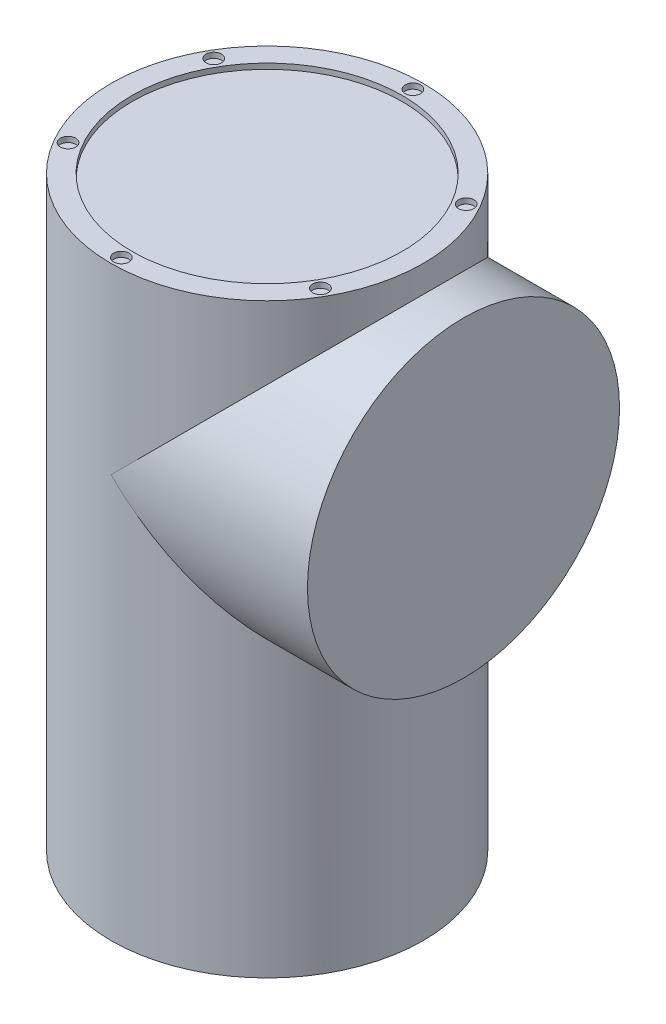
ISO-10303-21;
HEADER;
FILE_DESCRIPTION(('STEP AP214'),'2;1');
FILE_NAME('part.step','',(''),(''),'','','');
FILE_SCHEMA(('AUTOMOTIVE_DESIGN { 1 0 10303 214 1 1 1 1 }'));
ENDSEC;
DATA;
#1=APPLICATION_CONTEXT('core data for automotive mechanical design processes');
#2=APPLICATION_PROTOCOL_DEFINITION('international standard','automotive_design',2000,#1);
#3=PRODUCT_CONTEXT('',#1,'mechanical');
#4=PRODUCT('Part','Part','',(#3));
#5=PRODUCT_RELATED_PRODUCT_CATEGORY('part','',(#4));
#6=PRODUCT_DEFINITION_FORMATION('','',#4);
#7=PRODUCT_DEFINITION_CONTEXT('part definition',#1,'design');
#8=PRODUCT_DEFINITION('design','',#6,#7);
#9=PRODUCT_DEFINITION_SHAPE('','',#8);
#10=(LENGTH_UNIT() NAMED_UNIT(*) SI_UNIT(.MILLI.,.METRE.));
#11=(NAMED_UNIT(*) PLANE_ANGLE_UNIT() SI_UNIT($,.RADIAN.));
#12=(NAMED_UNIT(*) SI_UNIT($,.STERADIAN.) SOLID_ANGLE_UNIT());
#13=UNCERTAINTY_MEASURE_WITH_UNIT(LENGTH_MEASURE(1.E-05),#10,'distance_accuracy_value','');
#14=(GEOMETRIC_REPRESENTATION_CONTEXT(3) GLOBAL_UNCERTAINTY_ASSIGNED_CONTEXT((#13)) GLOBAL_UNIT_ASSIGNED_CONTEXT((#10,
#11,#12)) REPRESENTATION_CONTEXT('',''));
#15=CARTESIAN_POINT('',(0.,0.,0.));
#16=DIRECTION('',(0.,0.,1.));
#17=DIRECTION('',(1.,0.,0.));
#18=AXIS2_PLACEMENT_3D('',#15,#16,#17);
#19=CARTESIAN_POINT('',(0.,296.,0.));
#20=DIRECTION('',(0.,1.,0.));
#21=DIRECTION('',(-1.,0.,0.));
#22=AXIS2_PLACEMENT_3D('',#19,#20,#21);
#23=CYLINDRICAL_SURFACE('',#22,58.);
#24=CARTESIAN_POINT('',(0.,80.,0.));
#25=DIRECTION('',(0.,1.,0.));
#26=DIRECTION('',(-1.,0.,0.));
#27=AXIS2_PLACEMENT_3D('',#24,#25,#26);
#28=CIRCLE('',#27,58.);
#29=CARTESIAN_POINT('',(-58.,80.,0.));
#30=VERTEX_POINT('',#29);
#31=EDGE_CURVE('E124',#30,#30,#28,.T.);
#32=ORIENTED_EDGE('',*,*,#31,.T.);
#33=EDGE_LOOP('',(#32));
#34=FACE_BOUND('',#33,.T.);
#35=CARTESIAN_POINT('',(0.,298.,0.));
#36=DIRECTION('',(0.,1.,0.));
#37=DIRECTION('',(-1.,0.,0.));
#38=AXIS2_PLACEMENT_3D('',#35,#36,#37);
#39=CIRCLE('',#38,58.);
#40=CARTESIAN_POINT('',(-58.,298.,0.));
#41=VERTEX_POINT('',#40);
#42=EDGE_CURVE('E127',#41,#41,#39,.T.);
#43=ORIENTED_EDGE('',*,*,#42,.F.);
#44=EDGE_LOOP('',(#43));
#45=FACE_BOUND('',#44,.T.);
#46=CARTESIAN_POINT('',(0.,230.,0.));
#47=DIRECTION('',(0.707106781186547,0.707106781186548,0.));
#48=DIRECTION('',(-0.707106781186547,0.707106781186547,0.));
#49=AXIS2_PLACEMENT_3D('',#46,#47,#48);
#50=ELLIPSE('',#49,82.0243866176395,58.);
#51=CARTESIAN_POINT('',(0.,230.,-58.));
#52=VERTEX_POINT('',#51);
#53=CARTESIAN_POINT('',(0.,230.,58.));
#54=VERTEX_POINT('',#53);
#55=EDGE_CURVE('E60',#52,#54,#50,.F.);
#56=ORIENTED_EDGE('',*,*,#55,.T.);
#57=CARTESIAN_POINT('',(0.,230.,0.));
#58=DIRECTION('',(-0.707106781186547,0.707106781186547,0.));
#59=DIRECTION('',(0.707106781186547,0.707106781186548,0.));
#60=AXIS2_PLACEMENT_3D('',#57,#58,#59);
#61=ELLIPSE('',#60,82.0243866176395,58.);
#62=EDGE_CURVE('E11',#54,#52,#61,.T.);
#63=ORIENTED_EDGE('',*,*,#62,.T.);
#64=EDGE_LOOP('',(#56,#63));
#65=FACE_BOUND('',#64,.T.);
#66=ADVANCED_FACE('F51',(#34,#45,#65),#23,.T.);
#67=CARTESIAN_POINT('',(0.,298.,0.));
#68=DIRECTION('',(0.,1.,0.));
#69=DIRECTION('',(-1.,0.,0.));
#70=AXIS2_PLACEMENT_3D('',#67,#68,#69);
#71=PLANE('',#70);
#72=CARTESIAN_POINT('',(-46.9150617414256,298.,27.0864235254628));
#73=DIRECTION('',(0.,1.,0.));
#74=DIRECTION('',(-1.,0.,0.));
#75=AXIS2_PLACEMENT_3D('',#72,#73,#74);
#76=CIRCLE('',#75,2.86087839608435);
#77=CARTESIAN_POINT('',(-49.77594013751,298.,27.0864235254628));
#78=VERTEX_POINT('',#77);
#79=EDGE_CURVE('E348',#78,#78,#76,.T.);
#80=ORIENTED_EDGE('',*,*,#79,.F.);
#81=EDGE_LOOP('',(#80));
#82=FACE_BOUND('',#81,.T.);
#83=CARTESIAN_POINT('',(46.9150617414326,298.,27.0864235254612));
#84=DIRECTION('',(0.,1.,0.));
#85=DIRECTION('',(-1.,0.,0.));
#86=AXIS2_PLACEMENT_3D('',#83,#84,#85);
#87=CIRCLE('',#86,2.86087839608256);
#88=CARTESIAN_POINT('',(44.05418334535,298.,27.0864235254612));
#89=VERTEX_POINT('',#88);
#90=EDGE_CURVE('E340',#89,#89,#87,.T.);
#91=ORIENTED_EDGE('',*,*,#90,.F.);
#92=EDGE_LOOP('',(#91));
#93=FACE_BOUND('',#92,.T.);
#94=CARTESIAN_POINT('',(2.15212229815951E-12,298.,-54.172847050924));
#95=DIRECTION('',(0.,1.,0.));
#96=DIRECTION('',(-1.,0.,0.));
#97=AXIS2_PLACEMENT_3D('',#94,#95,#96);
#98=CIRCLE('',#97,2.86087839607868);
#99=CARTESIAN_POINT('',(-2.86087839607653,298.,-54.172847050924));
#100=VERTEX_POINT('',#99);
#101=EDGE_CURVE('E332',#100,#100,#98,.T.);
#102=ORIENTED_EDGE('',*,*,#101,.F.);
#103=EDGE_LOOP('',(#102));
#104=FACE_BOUND('',#103,.T.);
#105=ORIENTED_EDGE('',*,*,#42,.T.);
#106=EDGE_LOOP('',(#105));
#107=FACE_BOUND('',#106,.T.);
#108=CARTESIAN_POINT('',(0.,298.,0.));
#109=DIRECTION('',(0.,1.,0.));
#110=DIRECTION('',(-1.,0.,0.));
#111=AXIS2_PLACEMENT_3D('',#108,#109,#110);
#112=CIRCLE('',#111,50.2278473361148);
#113=CARTESIAN_POINT('',(-50.2278473361148,298.,0.));
#114=VERTEX_POINT('',#113);
#115=EDGE_CURVE('E135',#114,#114,#112,.T.);
#116=ORIENTED_EDGE('',*,*,#115,.F.);
#117=EDGE_LOOP('',(#116));
#118=FACE_BOUND('',#117,.T.);
#119=CARTESIAN_POINT('',(46.9150617414317,298.,-27.0864235254628));
#120=DIRECTION('',(0.,1.,0.));
#121=DIRECTION('',(-1.,0.,0.));
#122=AXIS2_PLACEMENT_3D('',#119,#120,#121);
#123=CIRCLE('',#122,2.8608783960795);
#124=CARTESIAN_POINT('',(44.0541833453522,298.,-27.0864235254628));
#125=VERTEX_POINT('',#124);
#126=EDGE_CURVE('E336',#125,#125,#123,.T.);
#127=ORIENTED_EDGE('',*,*,#126,.F.);
#128=EDGE_LOOP('',(#127));
#129=FACE_BOUND('',#128,.T.);
#130=CARTESIAN_POINT('',(3.94479992238097E-12,298.,54.172847050924));
#131=DIRECTION('',(0.,1.,0.));
#132=DIRECTION('',(-1.,0.,0.));
#133=AXIS2_PLACEMENT_3D('',#130,#131,#132);
#134=CIRCLE('',#133,2.86087839608491);
#135=CARTESIAN_POINT('',(-2.86087839608097,298.,54.172847050924));
#136=VERTEX_POINT('',#135);
#137=EDGE_CURVE('E344',#136,#136,#134,.T.);
#138=ORIENTED_EDGE('',*,*,#137,.F.);
#139=EDGE_LOOP('',(#138));
#140=FACE_BOUND('',#139,.T.);
#141=CARTESIAN_POINT('',(-46.9150617414265,298.,-27.0864235254612));
#142=DIRECTION('',(0.,1.,0.));
#143=DIRECTION('',(-1.,0.,0.));
#144=AXIS2_PLACEMENT_3D('',#141,#142,#143);
#145=CIRCLE('',#144,2.86087839608153);
#146=CARTESIAN_POINT('',(-49.775940137508,298.,-27.0864235254612));
#147=VERTEX_POINT('',#146);
#148=EDGE_CURVE('E352',#147,#147,#145,.T.);
#149=ORIENTED_EDGE('',*,*,#148,.F.);
#150=EDGE_LOOP('',(#149));
#151=FACE_BOUND('',#150,.T.);
#152=ADVANCED_FACE('F72',(#82,#93,#104,#107,#118,#129,#140,#151),#71,.T.);
#153=CARTESIAN_POINT('',(0.,298.,0.));
#154=DIRECTION('',(0.,-1.,0.));
#155=DIRECTION('',(1.,0.,0.));
#156=AXIS2_PLACEMENT_3D('',#153,#154,#155);
#157=CYLINDRICAL_SURFACE('',#156,50.2278473361148);
#158=ORIENTED_EDGE('',*,*,#115,.T.);
#159=EDGE_LOOP('',(#158));
#160=FACE_BOUND('',#159,.T.);
#161=CARTESIAN_POINT('',(0.,296.,0.));
#162=DIRECTION('',(0.,1.,0.));
#163=DIRECTION('',(-1.,0.,0.));
#164=AXIS2_PLACEMENT_3D('',#161,#162,#163);
#165=CIRCLE('',#164,50.2278473361148);
#166=CARTESIAN_POINT('',(-50.2278473361148,296.,0.));
#167=VERTEX_POINT('',#166);
#168=EDGE_CURVE('E70',#167,#167,#165,.F.);
#169=ORIENTED_EDGE('',*,*,#168,.T.);
#170=EDGE_LOOP('',(#169));
#171=FACE_BOUND('',#170,.T.);
#172=ADVANCED_FACE('F77',(#160,#171),#157,.F.);
#173=CARTESIAN_POINT('',(2.15212229815951E-12,298.,-54.172847050924));
#174=DIRECTION('',(0.,-1.,0.));
#175=DIRECTION('',(1.,0.,0.));
#176=AXIS2_PLACEMENT_3D('',#173,#174,#175);
#177=CYLINDRICAL_SURFACE('',#176,2.86087839607868);
#178=ORIENTED_EDGE('',*,*,#101,.T.);
#179=EDGE_LOOP('',(#178));
#180=FACE_BOUND('',#179,.T.);
#181=CARTESIAN_POINT('',(2.15226295141432E-12,296.,-54.172847050924));
#182=DIRECTION('',(0.,1.,0.));
#183=DIRECTION('',(-1.,0.,0.));
#184=AXIS2_PLACEMENT_3D('',#181,#182,#183);
#185=CIRCLE('',#184,2.86087839607868);
#186=CARTESIAN_POINT('',(-2.86087839607653,296.,-54.172847050924));
#187=VERTEX_POINT('',#186);
#188=EDGE_CURVE('E154',#187,#187,#185,.F.);
#189=ORIENTED_EDGE('',*,*,#188,.T.);
#190=EDGE_LOOP('',(#189));
#191=FACE_BOUND('',#190,.T.);
#192=ADVANCED_FACE('F85',(#180,#191),#177,.F.);
#193=CARTESIAN_POINT('',(46.9150617414317,298.,-27.0864235254628));
#194=DIRECTION('',(0.,-1.,0.));
#195=DIRECTION('',(1.,0.,0.));
#196=AXIS2_PLACEMENT_3D('',#193,#194,#195);
#197=CYLINDRICAL_SURFACE('',#196,2.8608783960795);
#198=ORIENTED_EDGE('',*,*,#126,.T.);
#199=EDGE_LOOP('',(#198));
#200=FACE_BOUND('',#199,.T.);
#201=CARTESIAN_POINT('',(46.9150617414317,296.,-27.0864235254628));
#202=DIRECTION('',(0.,1.,0.));
#203=DIRECTION('',(-1.,0.,0.));
#204=AXIS2_PLACEMENT_3D('',#201,#202,#203);
#205=CIRCLE('',#204,2.8608783960795);
#206=CARTESIAN_POINT('',(44.0541833453522,296.,-27.0864235254628));
#207=VERTEX_POINT('',#206);
#208=EDGE_CURVE('E150',#207,#207,#205,.F.);
#209=ORIENTED_EDGE('',*,*,#208,.T.);
#210=EDGE_LOOP('',(#209));
#211=FACE_BOUND('',#210,.T.);
#212=ADVANCED_FACE('F89',(#200,#211),#197,.F.);
#213=CARTESIAN_POINT('',(46.9150617414326,298.,27.0864235254612));
#214=DIRECTION('',(0.,-1.,0.));
#215=DIRECTION('',(1.,0.,0.));
#216=AXIS2_PLACEMENT_3D('',#213,#214,#215);
#217=CYLINDRICAL_SURFACE('',#216,2.86087839608256);
#218=ORIENTED_EDGE('',*,*,#90,.T.);
#219=EDGE_LOOP('',(#218));
#220=FACE_BOUND('',#219,.T.);
#221=CARTESIAN_POINT('',(46.9150617414326,296.,27.0864235254612));
#222=DIRECTION('',(0.,1.,0.));
#223=DIRECTION('',(-1.,0.,0.));
#224=AXIS2_PLACEMENT_3D('',#221,#222,#223);
#225=CIRCLE('',#224,2.86087839608256);
#226=CARTESIAN_POINT('',(44.05418334535,296.,27.0864235254612));
#227=VERTEX_POINT('',#226);
#228=EDGE_CURVE('E146',#227,#227,#225,.F.);
#229=ORIENTED_EDGE('',*,*,#228,.T.);
#230=EDGE_LOOP('',(#229));
#231=FACE_BOUND('',#230,.T.);
#232=ADVANCED_FACE('F93',(#220,#231),#217,.F.);
#233=CARTESIAN_POINT('',(3.94479992238097E-12,298.,54.172847050924));
#234=DIRECTION('',(0.,-1.,0.));
#235=DIRECTION('',(1.,0.,0.));
#236=AXIS2_PLACEMENT_3D('',#233,#234,#235);
#237=CYLINDRICAL_SURFACE('',#236,2.86087839608491);
#238=ORIENTED_EDGE('',*,*,#137,.T.);
#239=EDGE_LOOP('',(#238));
#240=FACE_BOUND('',#239,.T.);
#241=CARTESIAN_POINT('',(3.94494057563578E-12,296.,54.172847050924));
#242=DIRECTION('',(0.,1.,0.));
#243=DIRECTION('',(-1.,0.,0.));
#244=AXIS2_PLACEMENT_3D('',#241,#242,#243);
#245=CIRCLE('',#244,2.86087839608491);
#246=CARTESIAN_POINT('',(-2.86087839608097,296.,54.172847050924));
#247=VERTEX_POINT('',#246);
#248=EDGE_CURVE('E142',#247,#247,#245,.F.);
#249=ORIENTED_EDGE('',*,*,#248,.T.);
#250=EDGE_LOOP('',(#249));
#251=FACE_BOUND('',#250,.T.);
#252=ADVANCED_FACE('F97',(#240,#251),#237,.F.);
#253=CARTESIAN_POINT('',(-46.9150617414256,298.,27.0864235254628));
#254=DIRECTION('',(0.,-1.,0.));
#255=DIRECTION('',(1.,0.,0.));
#256=AXIS2_PLACEMENT_3D('',#253,#254,#255);
#257=CYLINDRICAL_SURFACE('',#256,2.86087839608435);
#258=ORIENTED_EDGE('',*,*,#79,.T.);
#259=EDGE_LOOP('',(#258));
#260=FACE_BOUND('',#259,.T.);
#261=CARTESIAN_POINT('',(-46.9150617414256,296.,27.0864235254628));
#262=DIRECTION('',(0.,1.,0.));
#263=DIRECTION('',(-1.,0.,0.));
#264=AXIS2_PLACEMENT_3D('',#261,#262,#263);
#265=CIRCLE('',#264,2.86087839608435);
#266=CARTESIAN_POINT('',(-49.77594013751,296.,27.0864235254628));
#267=VERTEX_POINT('',#266);
#268=EDGE_CURVE('E132',#267,#267,#265,.F.);
#269=ORIENTED_EDGE('',*,*,#268,.T.);
#270=EDGE_LOOP('',(#269));
#271=FACE_BOUND('',#270,.T.);
#272=ADVANCED_FACE('F101',(#260,#271),#257,.F.);
#273=CARTESIAN_POINT('',(-46.9150617414265,298.,-27.0864235254612));
#274=DIRECTION('',(0.,-1.,0.));
#275=DIRECTION('',(1.,0.,0.));
#276=AXIS2_PLACEMENT_3D('',#273,#274,#275);
#277=CYLINDRICAL_SURFACE('',#276,2.86087839608153);
#278=ORIENTED_EDGE('',*,*,#148,.T.);
#279=EDGE_LOOP('',(#278));
#280=FACE_BOUND('',#279,.T.);
#281=CARTESIAN_POINT('',(-46.9150617414265,296.,-27.0864235254612));
#282=DIRECTION('',(0.,1.,0.));
#283=DIRECTION('',(-1.,0.,0.));
#284=AXIS2_PLACEMENT_3D('',#281,#282,#283);
#285=CIRCLE('',#284,2.86087839608153);
#286=CARTESIAN_POINT('',(-49.775940137508,296.,-27.0864235254612));
#287=VERTEX_POINT('',#286);
#288=EDGE_CURVE('E126',#287,#287,#285,.F.);
#289=ORIENTED_EDGE('',*,*,#288,.T.);
#290=EDGE_LOOP('',(#289));
#291=FACE_BOUND('',#290,.T.);
#292=ADVANCED_FACE('F105',(#280,#291),#277,.F.);
#293=CARTESIAN_POINT('',(-58.,296.,0.));
#294=DIRECTION('',(0.,1.,0.));
#295=DIRECTION('',(-1.,0.,0.));
#296=AXIS2_PLACEMENT_3D('',#293,#294,#295);
#297=PLANE('',#296);
#298=ORIENTED_EDGE('',*,*,#288,.F.);
#299=EDGE_LOOP('',(#298));
#300=FACE_BOUND('',#299,.T.);
#301=ADVANCED_FACE('F109',(#300),#297,.T.);
#302=ORIENTED_EDGE('',*,*,#268,.F.);
#303=EDGE_LOOP('',(#302));
#304=FACE_BOUND('',#303,.T.);
#305=ADVANCED_FACE('F171',(#304),#297,.T.);
#306=ORIENTED_EDGE('',*,*,#248,.F.);
#307=EDGE_LOOP('',(#306));
#308=FACE_BOUND('',#307,.T.);
#309=ADVANCED_FACE('F176',(#308),#297,.T.);
#310=ORIENTED_EDGE('',*,*,#228,.F.);
#311=EDGE_LOOP('',(#310));
#312=FACE_BOUND('',#311,.T.);
#313=ADVANCED_FACE('F183',(#312),#297,.T.);
#314=ORIENTED_EDGE('',*,*,#208,.F.);
#315=EDGE_LOOP('',(#314));
#316=FACE_BOUND('',#315,.T.);
#317=ADVANCED_FACE('F168',(#316),#297,.T.);
#318=ORIENTED_EDGE('',*,*,#188,.F.);
#319=EDGE_LOOP('',(#318));
#320=FACE_BOUND('',#319,.T.);
#321=ADVANCED_FACE('F164',(#320),#297,.T.);
#322=ORIENTED_EDGE('',*,*,#168,.F.);
#323=EDGE_LOOP('',(#322));
#324=FACE_BOUND('',#323,.T.);
#325=ADVANCED_FACE('F53',(#324),#297,.T.);
#326=CARTESIAN_POINT('',(73.,230.,0.));
#327=DIRECTION('',(-1.,0.,0.));
#328=DIRECTION('',(0.,0.,1.));
#329=AXIS2_PLACEMENT_3D('',#326,#327,#328);
#330=CYLINDRICAL_SURFACE('',#329,58.);
#331=ORIENTED_EDGE('',*,*,#62,.F.);
#332=ORIENTED_EDGE('',*,*,#55,.F.);
#333=EDGE_LOOP('',(#331,#332));
#334=FACE_BOUND('',#333,.T.);
#335=CARTESIAN_POINT('',(73.,230.,0.));
#336=DIRECTION('',(1.,0.,0.));
#337=DIRECTION('',(0.,0.,-1.));
#338=AXIS2_PLACEMENT_3D('',#335,#336,#337);
#339=CIRCLE('',#338,58.);
#340=CARTESIAN_POINT('',(73.,230.,-58.));
#341=VERTEX_POINT('',#340);
#342=EDGE_CURVE('E356',#341,#341,#339,.T.);
#343=ORIENTED_EDGE('',*,*,#342,.F.);
#344=EDGE_LOOP('',(#343));
#345=FACE_BOUND('',#344,.T.);
#346=ADVANCED_FACE('F66',(#334,#345),#330,.T.);
#347=CARTESIAN_POINT('',(73.,230.,0.));
#348=DIRECTION('',(1.,0.,0.));
#349=DIRECTION('',(0.,0.,-1.));
#350=AXIS2_PLACEMENT_3D('',#347,#348,#349);
#351=PLANE('',#350);
#352=ORIENTED_EDGE('',*,*,#342,.T.);
#353=EDGE_LOOP('',(#352));
#354=FACE_BOUND('',#353,.T.);
#355=ADVANCED_FACE('F113',(#354),#351,.T.);
#356=CARTESIAN_POINT('',(-67.5000000000009,80.,100.677889502487));
#357=DIRECTION('',(0.,1.,0.));
#358=DIRECTION('',(0.,0.,1.));
#359=AXIS2_PLACEMENT_3D('',#356,#357,#358);
#360=PLANE('',#359);
#361=ORIENTED_EDGE('',*,*,#31,.F.);
#362=EDGE_LOOP('',(#361));
#363=FACE_BOUND('',#362,.T.);
#364=ADVANCED_FACE('F116',(#363),#360,.F.);
#365=CLOSED_SHELL('',(#66,#152,#172,#192,#212,#232,#252,#272,#292,#301,#305,#309,#313,#317,#321,
#325,#346,#355,#364));
#366=MANIFOLD_SOLID_BREP('B2',#365);
#367=ADVANCED_BREP_SHAPE_REPRESENTATION('',(#18,#366),#14);
#368=SHAPE_DEFINITION_REPRESENTATION(#9,#367);
ENDSEC;
END-ISO-10303-21;
